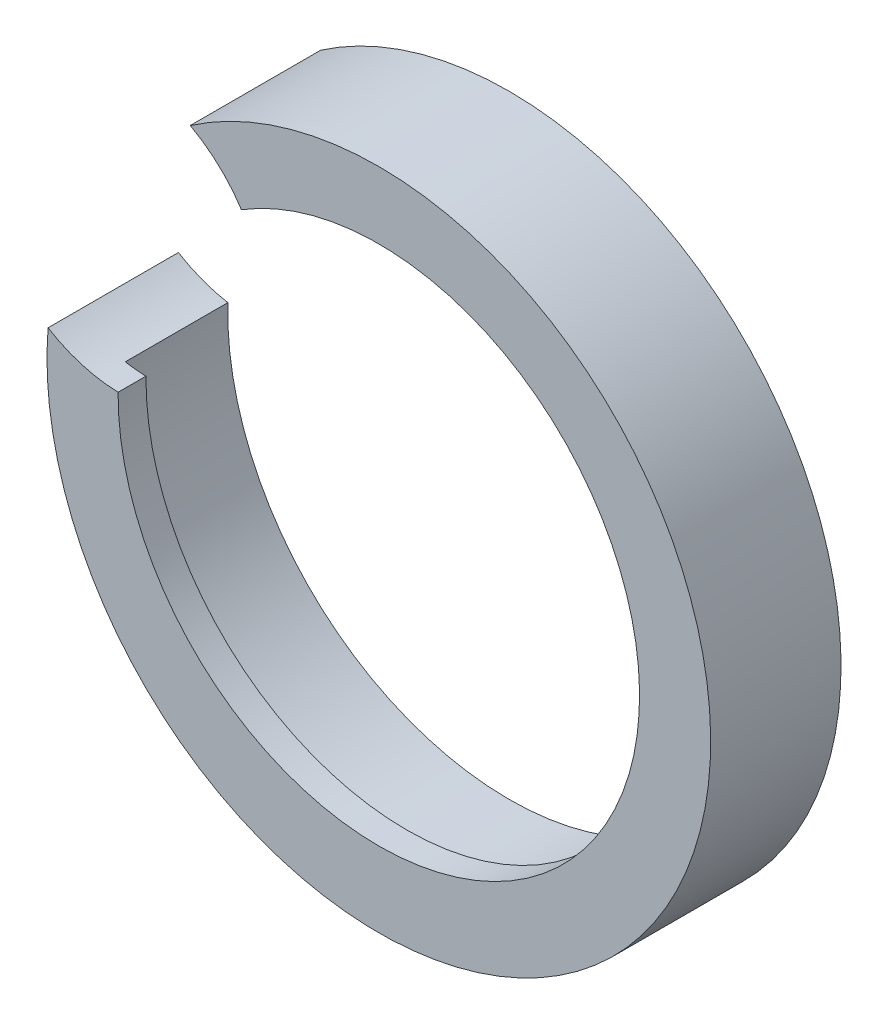
ISO-10303-21;
HEADER;
FILE_DESCRIPTION(('STEP AP214'),'2;1');
FILE_NAME('part.step','',(''),(''),'','','');
FILE_SCHEMA(('AUTOMOTIVE_DESIGN { 1 0 10303 214 1 1 1 1 }'));
ENDSEC;
DATA;
#1=APPLICATION_CONTEXT('core data for automotive mechanical design processes');
#2=APPLICATION_PROTOCOL_DEFINITION('international standard','automotive_design',2000,#1);
#3=PRODUCT_CONTEXT('',#1,'mechanical');
#4=PRODUCT('Part','Part','',(#3));
#5=PRODUCT_RELATED_PRODUCT_CATEGORY('part','',(#4));
#6=PRODUCT_DEFINITION_FORMATION('','',#4);
#7=PRODUCT_DEFINITION_CONTEXT('part definition',#1,'design');
#8=PRODUCT_DEFINITION('design','',#6,#7);
#9=PRODUCT_DEFINITION_SHAPE('','',#8);
#10=(LENGTH_UNIT() NAMED_UNIT(*) SI_UNIT(.MILLI.,.METRE.));
#11=(NAMED_UNIT(*) PLANE_ANGLE_UNIT() SI_UNIT($,.RADIAN.));
#12=(NAMED_UNIT(*) SI_UNIT($,.STERADIAN.) SOLID_ANGLE_UNIT());
#13=UNCERTAINTY_MEASURE_WITH_UNIT(LENGTH_MEASURE(1.E-05),#10,'distance_accuracy_value','');
#14=(GEOMETRIC_REPRESENTATION_CONTEXT(3) GLOBAL_UNCERTAINTY_ASSIGNED_CONTEXT((#13)) GLOBAL_UNIT_ASSIGNED_CONTEXT((#10,
#11,#12)) REPRESENTATION_CONTEXT('',''));
#15=CARTESIAN_POINT('',(0.,0.,0.));
#16=DIRECTION('',(0.,0.,1.));
#17=DIRECTION('',(1.,0.,0.));
#18=AXIS2_PLACEMENT_3D('',#15,#16,#17);
#19=CARTESIAN_POINT('',(0.,0.,20.));
#20=DIRECTION('',(0.,0.,-1.));
#21=DIRECTION('',(-1.,0.,0.));
#22=AXIS2_PLACEMENT_3D('',#19,#20,#21);
#23=CYLINDRICAL_SURFACE('',#22,47.5);
#24=DIRECTION('',(0.,0.,-1.));
#25=VECTOR('',#24,1.);
#26=CARTESIAN_POINT('',(-24.9237181838446,40.4358537920531,11.));
#27=LINE('',#26,#25);
#28=CARTESIAN_POINT('',(-24.9237181838446,40.4358537920531,0.));
#29=VERTEX_POINT('',#28);
#30=CARTESIAN_POINT('',(-24.9237181838446,40.4358537920531,17.3));
#31=VERTEX_POINT('',#30);
#32=EDGE_CURVE('E133',#29,#31,#27,.F.);
#33=ORIENTED_EDGE('',*,*,#32,.F.);
#34=CARTESIAN_POINT('',(0.,0.,0.));
#35=DIRECTION('',(0.,0.,1.));
#36=DIRECTION('',(1.,0.,0.));
#37=AXIS2_PLACEMENT_3D('',#34,#35,#36);
#38=CIRCLE('',#37,47.5);
#39=CARTESIAN_POINT('',(-47.4803356995536,1.3666462079465,0.));
#40=VERTEX_POINT('',#39);
#41=EDGE_CURVE('E124',#40,#29,#38,.T.);
#42=ORIENTED_EDGE('',*,*,#41,.F.);
#43=DIRECTION('',(0.,0.,-1.));
#44=VECTOR('',#43,1.);
#45=CARTESIAN_POINT('',(-47.4803356995536,1.3666462079465,11.));
#46=LINE('',#45,#44);
#47=CARTESIAN_POINT('',(-47.4803356995536,1.3666462079465,17.3));
#48=VERTEX_POINT('',#47);
#49=EDGE_CURVE('E135',#48,#40,#46,.T.);
#50=ORIENTED_EDGE('',*,*,#49,.F.);
#51=CARTESIAN_POINT('',(0.,0.,17.3));
#52=DIRECTION('',(0.,0.,1.));
#53=DIRECTION('',(1.,0.,0.));
#54=AXIS2_PLACEMENT_3D('',#51,#52,#53);
#55=CIRCLE('',#54,47.5);
#56=EDGE_CURVE('E116',#48,#31,#55,.T.);
#57=ORIENTED_EDGE('',*,*,#56,.T.);
#58=EDGE_LOOP('',(#33,#42,#50,#57));
#59=FACE_BOUND('',#58,.T.);
#60=ADVANCED_FACE('F50',(#59),#23,.F.);
#61=CARTESIAN_POINT('',(0.,0.,0.));
#62=DIRECTION('',(0.,0.,1.));
#63=DIRECTION('',(1.,0.,0.));
#64=AXIS2_PLACEMENT_3D('',#61,#62,#63);
#65=PLANE('',#64);
#66=ORIENTED_EDGE('',*,*,#41,.T.);
#67=CARTESIAN_POINT('',(-43.3012701892221,24.9999999999997,0.));
#68=DIRECTION('',(0.,0.,-1.));
#69=DIRECTION('',(-1.,0.,0.));
#70=AXIS2_PLACEMENT_3D('',#67,#68,#69);
#71=CIRCLE('',#70,24.);
#72=CARTESIAN_POINT('',(-31.8246360176135,46.0781134851072,0.));
#73=VERTEX_POINT('',#72);
#74=EDGE_CURVE('E104',#73,#29,#71,.T.);
#75=ORIENTED_EDGE('',*,*,#74,.F.);
#76=CARTESIAN_POINT('',(0.,0.,0.));
#77=DIRECTION('',(0.,0.,1.));
#78=DIRECTION('',(1.,0.,0.));
#79=AXIS2_PLACEMENT_3D('',#76,#77,#78);
#80=CIRCLE('',#79,56.);
#81=CARTESIAN_POINT('',(-55.8171348453719,4.52188651489232,0.));
#82=VERTEX_POINT('',#81);
#83=EDGE_CURVE('E54',#82,#73,#80,.T.);
#84=ORIENTED_EDGE('',*,*,#83,.F.);
#85=EDGE_CURVE('E155',#40,#82,#71,.T.);
#86=ORIENTED_EDGE('',*,*,#85,.F.);
#87=EDGE_LOOP('',(#66,#75,#84,#86));
#88=FACE_BOUND('',#87,.T.);
#89=ADVANCED_FACE('F151',(#88),#65,.F.);
#90=CARTESIAN_POINT('',(0.,0.,20.));
#91=DIRECTION('',(0.,0.,-1.));
#92=DIRECTION('',(-1.,0.,0.));
#93=AXIS2_PLACEMENT_3D('',#90,#91,#92);
#94=CYLINDRICAL_SURFACE('',#93,56.);
#95=ORIENTED_EDGE('',*,*,#83,.T.);
#96=DIRECTION('',(0.,0.,-1.));
#97=VECTOR('',#96,1.);
#98=CARTESIAN_POINT('',(-31.8246360176136,46.0781134851072,11.));
#99=LINE('',#98,#97);
#100=CARTESIAN_POINT('',(-31.8246360176136,46.0781134851072,22.));
#101=VERTEX_POINT('',#100);
#102=EDGE_CURVE('E97',#73,#101,#99,.F.);
#103=ORIENTED_EDGE('',*,*,#102,.T.);
#104=CARTESIAN_POINT('',(0.,0.,22.));
#105=DIRECTION('',(0.,0.,1.));
#106=DIRECTION('',(1.,0.,0.));
#107=AXIS2_PLACEMENT_3D('',#104,#105,#106);
#108=CIRCLE('',#107,56.);
#109=CARTESIAN_POINT('',(-55.8171348453719,4.52188651489233,22.));
#110=VERTEX_POINT('',#109);
#111=EDGE_CURVE('E109',#110,#101,#108,.T.);
#112=ORIENTED_EDGE('',*,*,#111,.F.);
#113=DIRECTION('',(0.,0.,-1.));
#114=VECTOR('',#113,1.);
#115=CARTESIAN_POINT('',(-55.817134845372,4.52188651489232,11.));
#116=LINE('',#115,#114);
#117=EDGE_CURVE('E66',#110,#82,#116,.T.);
#118=ORIENTED_EDGE('',*,*,#117,.T.);
#119=EDGE_LOOP('',(#95,#103,#112,#118));
#120=FACE_BOUND('',#119,.T.);
#121=ADVANCED_FACE('F47',(#120),#94,.T.);
#122=CARTESIAN_POINT('',(0.,0.,17.3));
#123=DIRECTION('',(0.,0.,1.));
#124=DIRECTION('',(1.,0.,0.));
#125=AXIS2_PLACEMENT_3D('',#122,#123,#124);
#126=PLANE('',#125);
#127=CARTESIAN_POINT('',(0.,0.690418179867988,17.3));
#128=DIRECTION('',(0.,0.,1.));
#129=DIRECTION('',(1.,0.,0.));
#130=AXIS2_PLACEMENT_3D('',#127,#128,#129);
#131=CIRCLE('',#130,44.);
#132=CARTESIAN_POINT('',(-43.9988383729438,1.01013967049679,17.3));
#133=VERTEX_POINT('',#132);
#134=CARTESIAN_POINT('',(-23.1835282313465,38.0872632172018,17.3));
#135=VERTEX_POINT('',#134);
#136=EDGE_CURVE('E113',#133,#135,#131,.T.);
#137=ORIENTED_EDGE('',*,*,#136,.T.);
#138=CARTESIAN_POINT('',(-43.3012701892221,24.9999999999997,17.3));
#139=DIRECTION('',(0.,0.,1.));
#140=DIRECTION('',(1.,0.,0.));
#141=AXIS2_PLACEMENT_3D('',#138,#139,#140);
#142=CIRCLE('',#141,24.);
#143=EDGE_CURVE('E136',#135,#31,#142,.T.);
#144=ORIENTED_EDGE('',*,*,#143,.T.);
#145=ORIENTED_EDGE('',*,*,#56,.F.);
#146=EDGE_CURVE('E139',#48,#133,#142,.T.);
#147=ORIENTED_EDGE('',*,*,#146,.T.);
#148=EDGE_LOOP('',(#137,#144,#145,#147));
#149=FACE_BOUND('',#148,.T.);
#150=ADVANCED_FACE('F137',(#149),#126,.F.);
#151=CARTESIAN_POINT('',(0.,0.690418179867988,17.3));
#152=DIRECTION('',(0.,0.,1.));
#153=DIRECTION('',(1.,0.,0.));
#154=AXIS2_PLACEMENT_3D('',#151,#152,#153);
#155=CYLINDRICAL_SURFACE('',#154,44.);
#156=ORIENTED_EDGE('',*,*,#136,.F.);
#157=DIRECTION('',(0.,0.,-1.));
#158=VECTOR('',#157,1.);
#159=CARTESIAN_POINT('',(-43.9988383729438,1.0101396704968,11.));
#160=LINE('',#159,#158);
#161=CARTESIAN_POINT('',(-43.9988383729438,1.0101396704968,22.));
#162=VERTEX_POINT('',#161);
#163=EDGE_CURVE('E143',#133,#162,#160,.F.);
#164=ORIENTED_EDGE('',*,*,#163,.T.);
#165=CARTESIAN_POINT('',(0.,0.690418179867988,22.));
#166=DIRECTION('',(0.,0.,1.));
#167=DIRECTION('',(1.,0.,0.));
#168=AXIS2_PLACEMENT_3D('',#165,#166,#167);
#169=CIRCLE('',#168,44.);
#170=CARTESIAN_POINT('',(-23.1835282313465,38.0872632172018,22.));
#171=VERTEX_POINT('',#170);
#172=EDGE_CURVE('E115',#162,#171,#169,.T.);
#173=ORIENTED_EDGE('',*,*,#172,.T.);
#174=DIRECTION('',(0.,0.,-1.));
#175=VECTOR('',#174,1.);
#176=CARTESIAN_POINT('',(-23.1835282313465,38.0872632172018,11.));
#177=LINE('',#176,#175);
#178=EDGE_CURVE('E65',#171,#135,#177,.T.);
#179=ORIENTED_EDGE('',*,*,#178,.T.);
#180=EDGE_LOOP('',(#156,#164,#173,#179));
#181=FACE_BOUND('',#180,.T.);
#182=ADVANCED_FACE('F161',(#181),#155,.F.);
#183=CARTESIAN_POINT('',(0.,0.,22.));
#184=DIRECTION('',(0.,0.,1.));
#185=DIRECTION('',(1.,0.,0.));
#186=AXIS2_PLACEMENT_3D('',#183,#184,#185);
#187=PLANE('',#186);
#188=CARTESIAN_POINT('',(-43.3012701892221,24.9999999999997,22.));
#189=DIRECTION('',(0.,0.,-1.));
#190=DIRECTION('',(-1.,0.,0.));
#191=AXIS2_PLACEMENT_3D('',#188,#189,#190);
#192=CIRCLE('',#191,24.);
#193=EDGE_CURVE('E96',#101,#171,#192,.T.);
#194=ORIENTED_EDGE('',*,*,#193,.T.);
#195=ORIENTED_EDGE('',*,*,#172,.F.);
#196=CARTESIAN_POINT('',(-43.3012701892221,24.9999999999997,22.));
#197=DIRECTION('',(0.,0.,1.));
#198=DIRECTION('',(1.,0.,0.));
#199=AXIS2_PLACEMENT_3D('',#196,#197,#198);
#200=CIRCLE('',#199,24.);
#201=EDGE_CURVE('E12',#110,#162,#200,.T.);
#202=ORIENTED_EDGE('',*,*,#201,.F.);
#203=ORIENTED_EDGE('',*,*,#111,.T.);
#204=EDGE_LOOP('',(#194,#195,#202,#203));
#205=FACE_BOUND('',#204,.T.);
#206=ADVANCED_FACE('F111',(#205),#187,.T.);
#207=CARTESIAN_POINT('',(-43.3012701892221,24.9999999999997,22.));
#208=DIRECTION('',(0.,0.,-1.));
#209=DIRECTION('',(-1.,0.,0.));
#210=AXIS2_PLACEMENT_3D('',#207,#208,#209);
#211=CYLINDRICAL_SURFACE('',#210,24.);
#212=ORIENTED_EDGE('',*,*,#201,.T.);
#213=ORIENTED_EDGE('',*,*,#163,.F.);
#214=ORIENTED_EDGE('',*,*,#146,.F.);
#215=ORIENTED_EDGE('',*,*,#49,.T.);
#216=ORIENTED_EDGE('',*,*,#85,.T.);
#217=ORIENTED_EDGE('',*,*,#117,.F.);
#218=EDGE_LOOP('',(#212,#213,#214,#215,#216,#217));
#219=FACE_BOUND('',#218,.T.);
#220=ADVANCED_FACE('F152',(#219),#211,.F.);
#221=ORIENTED_EDGE('',*,*,#74,.T.);
#222=ORIENTED_EDGE('',*,*,#32,.T.);
#223=ORIENTED_EDGE('',*,*,#143,.F.);
#224=ORIENTED_EDGE('',*,*,#178,.F.);
#225=ORIENTED_EDGE('',*,*,#193,.F.);
#226=ORIENTED_EDGE('',*,*,#102,.F.);
#227=EDGE_LOOP('',(#221,#222,#223,#224,#225,#226));
#228=FACE_BOUND('',#227,.T.);
#229=ADVANCED_FACE('F98',(#228),#211,.F.);
#230=CLOSED_SHELL('',(#60,#89,#121,#150,#182,#206,#220,#229));
#231=MANIFOLD_SOLID_BREP('B2',#230);
#232=ADVANCED_BREP_SHAPE_REPRESENTATION('',(#18,#231),#14);
#233=SHAPE_DEFINITION_REPRESENTATION(#9,#232);
ENDSEC;
END-ISO-10303-21;
